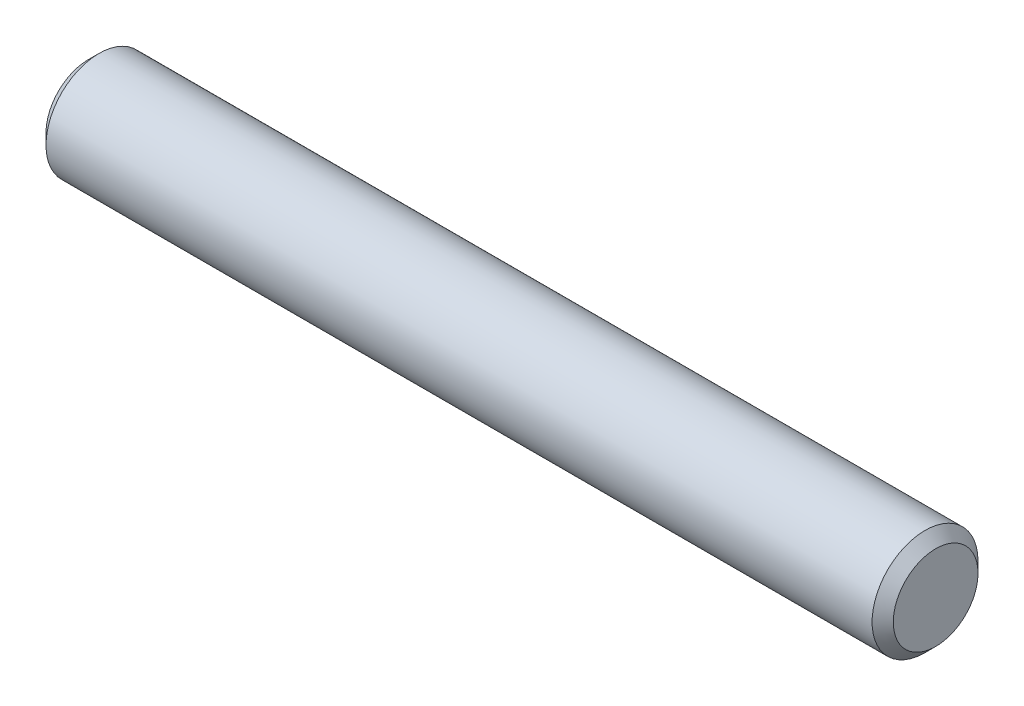
ISO-10303-21;
HEADER;
FILE_DESCRIPTION(('STEP AP214'),'2;1');
FILE_NAME('part.step','',(''),(''),'','','');
FILE_SCHEMA(('AUTOMOTIVE_DESIGN { 1 0 10303 214 1 1 1 1 }'));
ENDSEC;
DATA;
#1=APPLICATION_CONTEXT('core data for automotive mechanical design processes');
#2=APPLICATION_PROTOCOL_DEFINITION('international standard','automotive_design',2000,#1);
#3=PRODUCT_CONTEXT('',#1,'mechanical');
#4=PRODUCT('Part','Part','',(#3));
#5=PRODUCT_RELATED_PRODUCT_CATEGORY('part','',(#4));
#6=PRODUCT_DEFINITION_FORMATION('','',#4);
#7=PRODUCT_DEFINITION_CONTEXT('part definition',#1,'design');
#8=PRODUCT_DEFINITION('design','',#6,#7);
#9=PRODUCT_DEFINITION_SHAPE('','',#8);
#10=(LENGTH_UNIT() NAMED_UNIT(*) SI_UNIT(.MILLI.,.METRE.));
#11=(NAMED_UNIT(*) PLANE_ANGLE_UNIT() SI_UNIT($,.RADIAN.));
#12=(NAMED_UNIT(*) SI_UNIT($,.STERADIAN.) SOLID_ANGLE_UNIT());
#13=UNCERTAINTY_MEASURE_WITH_UNIT(LENGTH_MEASURE(1.E-05),#10,'distance_accuracy_value','');
#14=(GEOMETRIC_REPRESENTATION_CONTEXT(3) GLOBAL_UNCERTAINTY_ASSIGNED_CONTEXT((#13)) GLOBAL_UNIT_ASSIGNED_CONTEXT((#10,
#11,#12)) REPRESENTATION_CONTEXT('',''));
#15=CARTESIAN_POINT('',(0.,0.,0.));
#16=DIRECTION('',(0.,0.,1.));
#17=DIRECTION('',(1.,0.,0.));
#18=AXIS2_PLACEMENT_3D('',#15,#16,#17);
#19=CARTESIAN_POINT('',(-6.35,0.,0.));
#20=DIRECTION('',(1.,0.,0.));
#21=DIRECTION('',(0.,0.,-1.));
#22=AXIS2_PLACEMENT_3D('',#19,#20,#21);
#23=CYLINDRICAL_SURFACE('',#22,0.79375);
#24=CARTESIAN_POINT('',(6.19125,0.,0.));
#25=DIRECTION('',(1.,0.,0.));
#26=DIRECTION('',(0.,0.,-1.));
#27=AXIS2_PLACEMENT_3D('',#24,#25,#26);
#28=CIRCLE('',#27,0.79375);
#29=CARTESIAN_POINT('',(6.19125,0.,-0.79375));
#30=VERTEX_POINT('',#29);
#31=EDGE_CURVE('E40',#30,#30,#28,.F.);
#32=ORIENTED_EDGE('',*,*,#31,.T.);
#33=EDGE_LOOP('',(#32));
#34=FACE_BOUND('',#33,.T.);
#35=CARTESIAN_POINT('',(-6.19125,0.,0.));
#36=DIRECTION('',(1.,0.,0.));
#37=DIRECTION('',(0.,0.,-1.));
#38=AXIS2_PLACEMENT_3D('',#35,#36,#37);
#39=CIRCLE('',#38,0.79375);
#40=CARTESIAN_POINT('',(-6.19125,0.,-0.79375));
#41=VERTEX_POINT('',#40);
#42=EDGE_CURVE('E44',#41,#41,#39,.T.);
#43=ORIENTED_EDGE('',*,*,#42,.T.);
#44=EDGE_LOOP('',(#43));
#45=FACE_BOUND('',#44,.T.);
#46=ADVANCED_FACE('F33',(#34,#45),#23,.T.);
#47=CARTESIAN_POINT('',(-6.35,0.,0.));
#48=DIRECTION('',(1.,0.,0.));
#49=DIRECTION('',(0.,0.,-1.));
#50=AXIS2_PLACEMENT_3D('',#47,#48,#49);
#51=PLANE('',#50);
#52=CARTESIAN_POINT('',(-6.35,0.,0.));
#53=DIRECTION('',(1.,0.,0.));
#54=DIRECTION('',(0.,0.,-1.));
#55=AXIS2_PLACEMENT_3D('',#52,#53,#54);
#56=CIRCLE('',#55,0.634999999999997);
#57=CARTESIAN_POINT('',(-6.35,0.,-0.634999999999997));
#58=VERTEX_POINT('',#57);
#59=EDGE_CURVE('E10',#58,#58,#56,.F.);
#60=ORIENTED_EDGE('',*,*,#59,.T.);
#61=EDGE_LOOP('',(#60));
#62=FACE_BOUND('',#61,.T.);
#63=ADVANCED_FACE('F64',(#62),#51,.F.);
#64=CARTESIAN_POINT('',(6.35,0.,0.));
#65=DIRECTION('',(1.,0.,0.));
#66=DIRECTION('',(0.,0.,-1.));
#67=AXIS2_PLACEMENT_3D('',#64,#65,#66);
#68=PLANE('',#67);
#69=CARTESIAN_POINT('',(6.35,0.,0.));
#70=DIRECTION('',(1.,0.,0.));
#71=DIRECTION('',(0.,0.,-1.));
#72=AXIS2_PLACEMENT_3D('',#69,#70,#71);
#73=CIRCLE('',#72,0.635);
#74=CARTESIAN_POINT('',(6.35,0.,-0.635));
#75=VERTEX_POINT('',#74);
#76=EDGE_CURVE('E48',#75,#75,#73,.T.);
#77=ORIENTED_EDGE('',*,*,#76,.T.);
#78=EDGE_LOOP('',(#77));
#79=FACE_BOUND('',#78,.T.);
#80=ADVANCED_FACE('F54',(#79),#68,.T.);
#81=CARTESIAN_POINT('',(6.35,0.,0.));
#82=DIRECTION('',(-1.,0.,0.));
#83=DIRECTION('',(0.,0.,1.));
#84=AXIS2_PLACEMENT_3D('',#81,#82,#83);
#85=CONICAL_SURFACE('',#84,0.635,0.785398163397445);
#86=ORIENTED_EDGE('',*,*,#31,.F.);
#87=EDGE_LOOP('',(#86));
#88=FACE_BOUND('',#87,.T.);
#89=ORIENTED_EDGE('',*,*,#76,.F.);
#90=EDGE_LOOP('',(#89));
#91=FACE_BOUND('',#90,.T.);
#92=ADVANCED_FACE('F56',(#88,#91),#85,.T.);
#93=CARTESIAN_POINT('',(-6.19125,0.,0.));
#94=DIRECTION('',(1.,0.,0.));
#95=DIRECTION('',(0.,0.,-1.));
#96=AXIS2_PLACEMENT_3D('',#93,#94,#95);
#97=CONICAL_SURFACE('',#96,0.79375,0.78539816339745);
#98=ORIENTED_EDGE('',*,*,#59,.F.);
#99=EDGE_LOOP('',(#98));
#100=FACE_BOUND('',#99,.T.);
#101=ORIENTED_EDGE('',*,*,#42,.F.);
#102=EDGE_LOOP('',(#101));
#103=FACE_BOUND('',#102,.T.);
#104=ADVANCED_FACE('F35',(#100,#103),#97,.T.);
#105=CLOSED_SHELL('',(#46,#63,#80,#92,#104));
#106=MANIFOLD_SOLID_BREP('B2',#105);
#107=ADVANCED_BREP_SHAPE_REPRESENTATION('',(#18,#106),#14);
#108=SHAPE_DEFINITION_REPRESENTATION(#9,#107);
ENDSEC;
END-ISO-10303-21;
